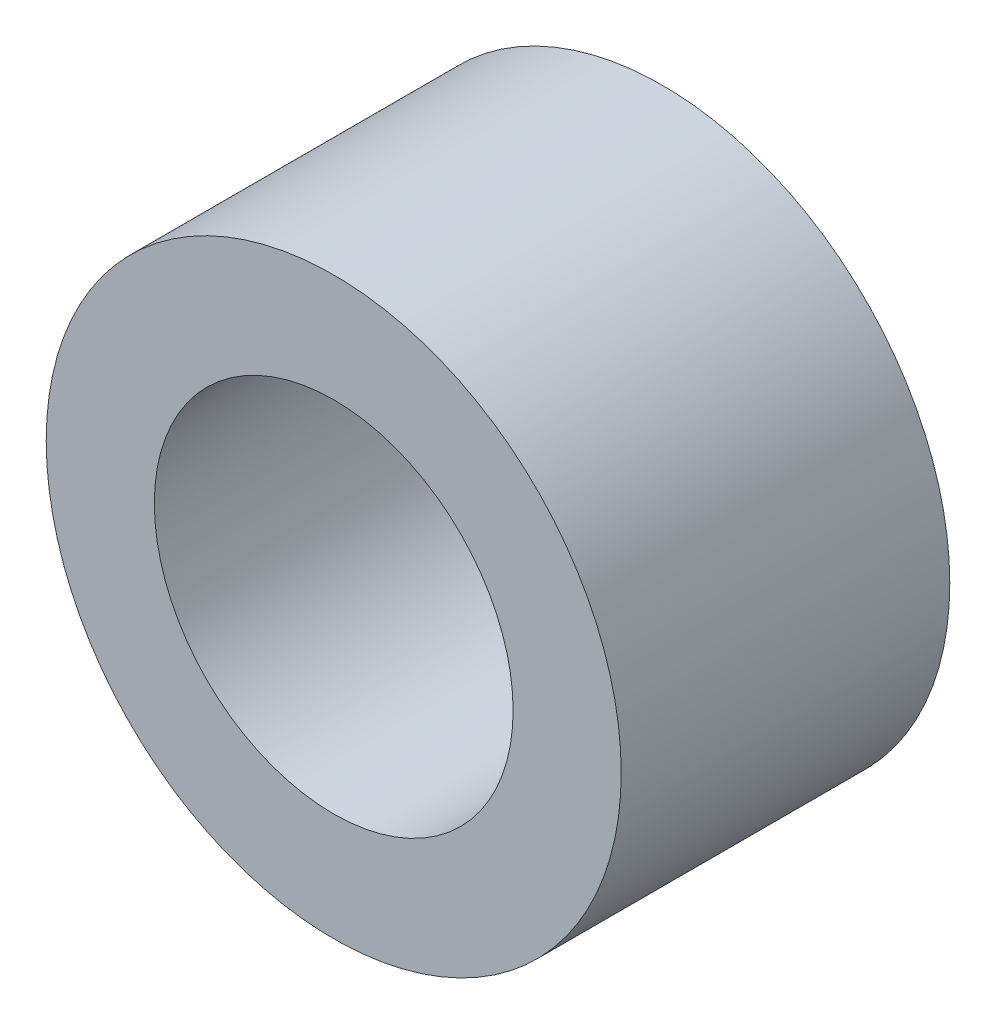
ISO-10303-21;
HEADER;
FILE_DESCRIPTION(('STEP AP214'),'2;1');
FILE_NAME('part.step','',(''),(''),'','','');
FILE_SCHEMA(('AUTOMOTIVE_DESIGN { 1 0 10303 214 1 1 1 1 }'));
ENDSEC;
DATA;
#1=APPLICATION_CONTEXT('core data for automotive mechanical design processes');
#2=APPLICATION_PROTOCOL_DEFINITION('international standard','automotive_design',2000,#1);
#3=PRODUCT_CONTEXT('',#1,'mechanical');
#4=PRODUCT('Part','Part','',(#3));
#5=PRODUCT_RELATED_PRODUCT_CATEGORY('part','',(#4));
#6=PRODUCT_DEFINITION_FORMATION('','',#4);
#7=PRODUCT_DEFINITION_CONTEXT('part definition',#1,'design');
#8=PRODUCT_DEFINITION('design','',#6,#7);
#9=PRODUCT_DEFINITION_SHAPE('','',#8);
#10=(LENGTH_UNIT() NAMED_UNIT(*) SI_UNIT(.MILLI.,.METRE.));
#11=(NAMED_UNIT(*) PLANE_ANGLE_UNIT() SI_UNIT($,.RADIAN.));
#12=(NAMED_UNIT(*) SI_UNIT($,.STERADIAN.) SOLID_ANGLE_UNIT());
#13=UNCERTAINTY_MEASURE_WITH_UNIT(LENGTH_MEASURE(1.E-05),#10,'distance_accuracy_value','');
#14=(GEOMETRIC_REPRESENTATION_CONTEXT(3) GLOBAL_UNCERTAINTY_ASSIGNED_CONTEXT((#13)) GLOBAL_UNIT_ASSIGNED_CONTEXT((#10,
#11,#12)) REPRESENTATION_CONTEXT('',''));
#15=CARTESIAN_POINT('',(0.,0.,0.));
#16=DIRECTION('',(0.,0.,1.));
#17=DIRECTION('',(1.,0.,0.));
#18=AXIS2_PLACEMENT_3D('',#15,#16,#17);
#19=CARTESIAN_POINT('',(0.,0.,12.7));
#20=DIRECTION('',(0.,0.,1.));
#21=DIRECTION('',(1.,0.,0.));
#22=AXIS2_PLACEMENT_3D('',#19,#20,#21);
#23=PLANE('',#22);
#24=CARTESIAN_POINT('',(0.,0.,12.7));
#25=DIRECTION('',(0.,0.,1.));
#26=DIRECTION('',(1.,0.,0.));
#27=AXIS2_PLACEMENT_3D('',#24,#25,#26);
#28=CIRCLE('',#27,11.1125);
#29=CARTESIAN_POINT('',(11.1125,0.,12.7));
#30=VERTEX_POINT('',#29);
#31=EDGE_CURVE('E10',#30,#30,#28,.T.);
#32=ORIENTED_EDGE('',*,*,#31,.T.);
#33=EDGE_LOOP('',(#32));
#34=FACE_BOUND('',#33,.T.);
#35=CARTESIAN_POINT('',(0.,0.,12.7));
#36=DIRECTION('',(0.,0.,1.));
#37=DIRECTION('',(1.,0.,0.));
#38=AXIS2_PLACEMENT_3D('',#35,#36,#37);
#39=CIRCLE('',#38,6.9342);
#40=CARTESIAN_POINT('',(6.9342,0.,12.7));
#41=VERTEX_POINT('',#40);
#42=EDGE_CURVE('E42',#41,#41,#39,.T.);
#43=ORIENTED_EDGE('',*,*,#42,.F.);
#44=EDGE_LOOP('',(#43));
#45=FACE_BOUND('',#44,.T.);
#46=ADVANCED_FACE('F31',(#34,#45),#23,.T.);
#47=CARTESIAN_POINT('',(0.,0.,0.));
#48=DIRECTION('',(0.,0.,1.));
#49=DIRECTION('',(1.,0.,0.));
#50=AXIS2_PLACEMENT_3D('',#47,#48,#49);
#51=PLANE('',#50);
#52=CARTESIAN_POINT('',(0.,0.,0.));
#53=DIRECTION('',(0.,0.,1.));
#54=DIRECTION('',(1.,0.,0.));
#55=AXIS2_PLACEMENT_3D('',#52,#53,#54);
#56=CIRCLE('',#55,11.1125);
#57=CARTESIAN_POINT('',(11.1125,0.,0.));
#58=VERTEX_POINT('',#57);
#59=EDGE_CURVE('E35',#58,#58,#56,.T.);
#60=ORIENTED_EDGE('',*,*,#59,.F.);
#61=EDGE_LOOP('',(#60));
#62=FACE_BOUND('',#61,.T.);
#63=CARTESIAN_POINT('',(0.,0.,0.));
#64=DIRECTION('',(0.,0.,1.));
#65=DIRECTION('',(1.,0.,0.));
#66=AXIS2_PLACEMENT_3D('',#63,#64,#65);
#67=CIRCLE('',#66,6.9342);
#68=CARTESIAN_POINT('',(6.9342,0.,0.));
#69=VERTEX_POINT('',#68);
#70=EDGE_CURVE('E44',#69,#69,#67,.T.);
#71=ORIENTED_EDGE('',*,*,#70,.T.);
#72=EDGE_LOOP('',(#71));
#73=FACE_BOUND('',#72,.T.);
#74=ADVANCED_FACE('F54',(#62,#73),#51,.F.);
#75=CARTESIAN_POINT('',(0.,0.,12.7));
#76=DIRECTION('',(0.,0.,-1.));
#77=DIRECTION('',(-1.,0.,0.));
#78=AXIS2_PLACEMENT_3D('',#75,#76,#77);
#79=CYLINDRICAL_SURFACE('',#78,11.1125);
#80=ORIENTED_EDGE('',*,*,#31,.F.);
#81=EDGE_LOOP('',(#80));
#82=FACE_BOUND('',#81,.T.);
#83=ORIENTED_EDGE('',*,*,#59,.T.);
#84=EDGE_LOOP('',(#83));
#85=FACE_BOUND('',#84,.T.);
#86=ADVANCED_FACE('F33',(#82,#85),#79,.T.);
#87=CARTESIAN_POINT('',(0.,0.,12.7));
#88=DIRECTION('',(0.,0.,-1.));
#89=DIRECTION('',(-1.,0.,0.));
#90=AXIS2_PLACEMENT_3D('',#87,#88,#89);
#91=CYLINDRICAL_SURFACE('',#90,6.9342);
#92=ORIENTED_EDGE('',*,*,#42,.T.);
#93=EDGE_LOOP('',(#92));
#94=FACE_BOUND('',#93,.T.);
#95=ORIENTED_EDGE('',*,*,#70,.F.);
#96=EDGE_LOOP('',(#95));
#97=FACE_BOUND('',#96,.T.);
#98=ADVANCED_FACE('F50',(#94,#97),#91,.F.);
#99=CLOSED_SHELL('',(#46,#74,#86,#98));
#100=MANIFOLD_SOLID_BREP('B2',#99);
#101=ADVANCED_BREP_SHAPE_REPRESENTATION('',(#18,#100),#14);
#102=SHAPE_DEFINITION_REPRESENTATION(#9,#101);
ENDSEC;
END-ISO-10303-21;
